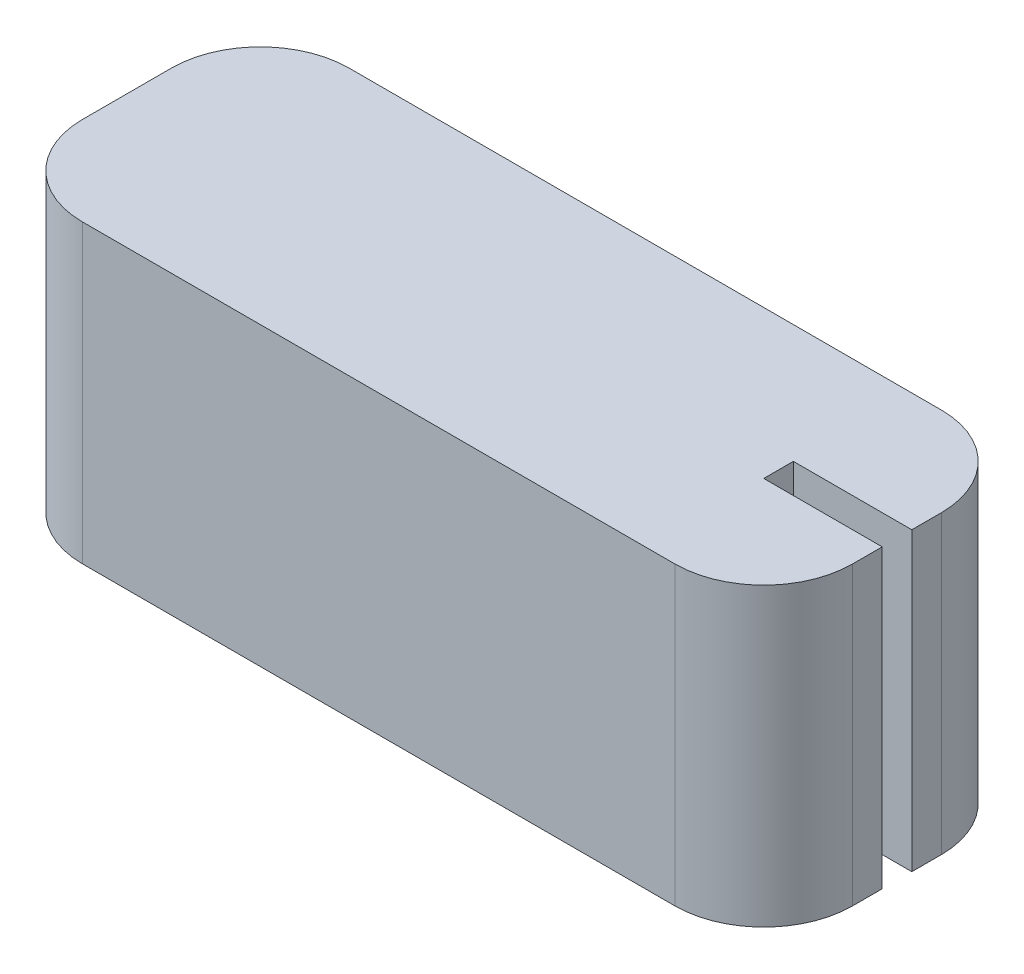
ISO-10303-21;
HEADER;
FILE_DESCRIPTION(('STEP AP214'),'2;1');
FILE_NAME('part.step','',(''),(''),'','','');
FILE_SCHEMA(('AUTOMOTIVE_DESIGN { 1 0 10303 214 1 1 1 1 }'));
ENDSEC;
DATA;
#1=APPLICATION_CONTEXT('core data for automotive mechanical design processes');
#2=APPLICATION_PROTOCOL_DEFINITION('international standard','automotive_design',2000,#1);
#3=PRODUCT_CONTEXT('',#1,'mechanical');
#4=PRODUCT('Part','Part','',(#3));
#5=PRODUCT_RELATED_PRODUCT_CATEGORY('part','',(#4));
#6=PRODUCT_DEFINITION_FORMATION('','',#4);
#7=PRODUCT_DEFINITION_CONTEXT('part definition',#1,'design');
#8=PRODUCT_DEFINITION('design','',#6,#7);
#9=PRODUCT_DEFINITION_SHAPE('','',#8);
#10=(LENGTH_UNIT() NAMED_UNIT(*) SI_UNIT(.MILLI.,.METRE.));
#11=(NAMED_UNIT(*) PLANE_ANGLE_UNIT() SI_UNIT($,.RADIAN.));
#12=(NAMED_UNIT(*) SI_UNIT($,.STERADIAN.) SOLID_ANGLE_UNIT());
#13=UNCERTAINTY_MEASURE_WITH_UNIT(LENGTH_MEASURE(1.E-05),#10,'distance_accuracy_value','');
#14=(GEOMETRIC_REPRESENTATION_CONTEXT(3) GLOBAL_UNCERTAINTY_ASSIGNED_CONTEXT((#13)) GLOBAL_UNIT_ASSIGNED_CONTEXT((#10,
#11,#12)) REPRESENTATION_CONTEXT('',''));
#15=CARTESIAN_POINT('',(0.,0.,0.));
#16=DIRECTION('',(0.,0.,1.));
#17=DIRECTION('',(1.,0.,0.));
#18=AXIS2_PLACEMENT_3D('',#15,#16,#17);
#19=CARTESIAN_POINT('',(21.,0.,-4.5));
#20=DIRECTION('',(1.,0.,0.));
#21=DIRECTION('',(0.,0.,-1.));
#22=AXIS2_PLACEMENT_3D('',#19,#20,#21);
#23=PLANE('',#22);
#24=DIRECTION('',(0.,0.,-1.));
#25=VECTOR('',#24,1.);
#26=CARTESIAN_POINT('',(21.,0.,-4.5));
#27=LINE('',#26,#25);
#28=CARTESIAN_POINT('',(21.,0.,-0.5));
#29=VERTEX_POINT('',#28);
#30=CARTESIAN_POINT('',(21.,0.,-1.5));
#31=VERTEX_POINT('',#30);
#32=EDGE_CURVE('E273',#29,#31,#27,.T.);
#33=ORIENTED_EDGE('',*,*,#32,.T.);
#34=DIRECTION('',(0.,1.,0.));
#35=VECTOR('',#34,1.);
#36=CARTESIAN_POINT('',(21.,0.,-1.5));
#37=LINE('',#36,#35);
#38=CARTESIAN_POINT('',(21.,10.,-1.5));
#39=VERTEX_POINT('',#38);
#40=EDGE_CURVE('E297',#31,#39,#37,.T.);
#41=ORIENTED_EDGE('',*,*,#40,.T.);
#42=DIRECTION('',(0.,0.,-1.));
#43=VECTOR('',#42,1.);
#44=CARTESIAN_POINT('',(21.,10.,-4.5));
#45=LINE('',#44,#43);
#46=CARTESIAN_POINT('',(21.,10.,-0.5));
#47=VERTEX_POINT('',#46);
#48=EDGE_CURVE('E226',#47,#39,#45,.T.);
#49=ORIENTED_EDGE('',*,*,#48,.F.);
#50=DIRECTION('',(0.,1.,0.));
#51=VECTOR('',#50,1.);
#52=CARTESIAN_POINT('',(21.,10.,-0.5));
#53=LINE('',#52,#51);
#54=EDGE_CURVE('E195',#47,#29,#53,.F.);
#55=ORIENTED_EDGE('',*,*,#54,.T.);
#56=EDGE_LOOP('',(#33,#41,#49,#55));
#57=FACE_BOUND('',#56,.T.);
#58=ADVANCED_FACE('F49',(#57),#23,.T.);
#59=CARTESIAN_POINT('',(15.6,0.,0.));
#60=DIRECTION('',(0.,1.,0.));
#61=DIRECTION('',(0.,0.,1.));
#62=AXIS2_PLACEMENT_3D('',#59,#60,#61);
#63=CYLINDRICAL_SURFACE('',#62,2.6);
#64=DIRECTION('',(0.,1.,0.));
#65=VECTOR('',#64,1.);
#66=CARTESIAN_POINT('',(18.1514701644346,0.,-0.5));
#67=LINE('',#66,#65);
#68=CARTESIAN_POINT('',(18.1514701644346,5.,-0.5));
#69=VERTEX_POINT('',#68);
#70=CARTESIAN_POINT('',(18.1514701644346,0.,-0.5));
#71=VERTEX_POINT('',#70);
#72=EDGE_CURVE('E214',#69,#71,#67,.F.);
#73=ORIENTED_EDGE('',*,*,#72,.F.);
#74=CARTESIAN_POINT('',(15.6,5.,0.));
#75=DIRECTION('',(0.,1.,0.));
#76=DIRECTION('',(0.,0.,1.));
#77=AXIS2_PLACEMENT_3D('',#74,#75,#76);
#78=CIRCLE('',#77,2.6);
#79=CARTESIAN_POINT('',(15.775,5.,-2.59410389152015));
#80=VERTEX_POINT('',#79);
#81=EDGE_CURVE('E251',#69,#80,#78,.T.);
#82=ORIENTED_EDGE('',*,*,#81,.T.);
#83=DIRECTION('',(0.,1.,0.));
#84=VECTOR('',#83,1.);
#85=CARTESIAN_POINT('',(15.775,0.,-2.59410389152015));
#86=LINE('',#85,#84);
#87=CARTESIAN_POINT('',(15.775,0.,-2.59410389152015));
#88=VERTEX_POINT('',#87);
#89=EDGE_CURVE('E261',#88,#80,#86,.T.);
#90=ORIENTED_EDGE('',*,*,#89,.F.);
#91=CARTESIAN_POINT('',(15.6,0.,0.));
#92=DIRECTION('',(0.,1.,0.));
#93=DIRECTION('',(0.,0.,1.));
#94=AXIS2_PLACEMENT_3D('',#91,#92,#93);
#95=CIRCLE('',#94,2.6);
#96=EDGE_CURVE('E238',#71,#88,#95,.T.);
#97=ORIENTED_EDGE('',*,*,#96,.F.);
#98=EDGE_LOOP('',(#73,#82,#90,#97));
#99=FACE_BOUND('',#98,.T.);
#100=ADVANCED_FACE('F369',(#99),#63,.F.);
#101=CARTESIAN_POINT('',(-5.,0.,-4.5));
#102=DIRECTION('',(-1.,0.,0.));
#103=DIRECTION('',(0.,0.,1.));
#104=AXIS2_PLACEMENT_3D('',#101,#102,#103);
#105=PLANE('',#104);
#106=DIRECTION('',(0.,0.,1.));
#107=VECTOR('',#106,1.);
#108=CARTESIAN_POINT('',(-5.,10.,-4.5));
#109=LINE('',#108,#107);
#110=CARTESIAN_POINT('',(-5.,10.,-1.5));
#111=VERTEX_POINT('',#110);
#112=CARTESIAN_POINT('',(-5.,10.,1.5));
#113=VERTEX_POINT('',#112);
#114=EDGE_CURVE('E220',#111,#113,#109,.T.);
#115=ORIENTED_EDGE('',*,*,#114,.F.);
#116=DIRECTION('',(0.,1.,0.));
#117=VECTOR('',#116,1.);
#118=CARTESIAN_POINT('',(-5.,0.,-1.5));
#119=LINE('',#118,#117);
#120=CARTESIAN_POINT('',(-5.,0.,-1.5));
#121=VERTEX_POINT('',#120);
#122=EDGE_CURVE('E288',#111,#121,#119,.F.);
#123=ORIENTED_EDGE('',*,*,#122,.T.);
#124=DIRECTION('',(0.,0.,1.));
#125=VECTOR('',#124,1.);
#126=CARTESIAN_POINT('',(-5.,0.,-4.5));
#127=LINE('',#126,#125);
#128=CARTESIAN_POINT('',(-5.,0.,1.5));
#129=VERTEX_POINT('',#128);
#130=EDGE_CURVE('E260',#121,#129,#127,.T.);
#131=ORIENTED_EDGE('',*,*,#130,.T.);
#132=DIRECTION('',(0.,1.,0.));
#133=VECTOR('',#132,1.);
#134=CARTESIAN_POINT('',(-5.,0.,1.5));
#135=LINE('',#134,#133);
#136=EDGE_CURVE('E285',#129,#113,#135,.T.);
#137=ORIENTED_EDGE('',*,*,#136,.T.);
#138=EDGE_LOOP('',(#115,#123,#131,#137));
#139=FACE_BOUND('',#138,.T.);
#140=ADVANCED_FACE('F321',(#139),#105,.T.);
#141=CARTESIAN_POINT('',(-5.,0.,-4.5));
#142=DIRECTION('',(0.,0.,-1.));
#143=DIRECTION('',(-1.,0.,0.));
#144=AXIS2_PLACEMENT_3D('',#141,#142,#143);
#145=PLANE('',#144);
#146=DIRECTION('',(-1.,0.,0.));
#147=VECTOR('',#146,1.);
#148=CARTESIAN_POINT('',(-5.,10.,-4.5));
#149=LINE('',#148,#147);
#150=CARTESIAN_POINT('',(18.,10.,-4.5));
#151=VERTEX_POINT('',#150);
#152=CARTESIAN_POINT('',(-2.,10.,-4.5));
#153=VERTEX_POINT('',#152);
#154=EDGE_CURVE('E228',#151,#153,#149,.T.);
#155=ORIENTED_EDGE('',*,*,#154,.F.);
#156=DIRECTION('',(0.,1.,0.));
#157=VECTOR('',#156,1.);
#158=CARTESIAN_POINT('',(18.,0.,-4.5));
#159=LINE('',#158,#157);
#160=CARTESIAN_POINT('',(18.,0.,-4.5));
#161=VERTEX_POINT('',#160);
#162=EDGE_CURVE('E304',#151,#161,#159,.F.);
#163=ORIENTED_EDGE('',*,*,#162,.T.);
#164=DIRECTION('',(-1.,0.,0.));
#165=VECTOR('',#164,1.);
#166=CARTESIAN_POINT('',(-5.,0.,-4.5));
#167=LINE('',#166,#165);
#168=CARTESIAN_POINT('',(-2.,0.,-4.5));
#169=VERTEX_POINT('',#168);
#170=EDGE_CURVE('E276',#161,#169,#167,.T.);
#171=ORIENTED_EDGE('',*,*,#170,.T.);
#172=DIRECTION('',(0.,1.,0.));
#173=VECTOR('',#172,1.);
#174=CARTESIAN_POINT('',(-2.,0.,-4.5));
#175=LINE('',#174,#173);
#176=EDGE_CURVE('E278',#169,#153,#175,.T.);
#177=ORIENTED_EDGE('',*,*,#176,.T.);
#178=EDGE_LOOP('',(#155,#163,#171,#177));
#179=FACE_BOUND('',#178,.T.);
#180=ADVANCED_FACE('F333',(#179),#145,.T.);
#181=CARTESIAN_POINT('',(21.,10.,1.5));
#182=VERTEX_POINT('',#181);
#183=CARTESIAN_POINT('',(21.,10.,0.5));
#184=VERTEX_POINT('',#183);
#185=EDGE_CURVE('E199',#182,#184,#45,.T.);
#186=ORIENTED_EDGE('',*,*,#185,.F.);
#187=DIRECTION('',(0.,1.,0.));
#188=VECTOR('',#187,1.);
#189=CARTESIAN_POINT('',(21.,0.,1.5));
#190=LINE('',#189,#188);
#191=CARTESIAN_POINT('',(21.,0.,1.5));
#192=VERTEX_POINT('',#191);
#193=EDGE_CURVE('E12',#182,#192,#190,.F.);
#194=ORIENTED_EDGE('',*,*,#193,.T.);
#195=CARTESIAN_POINT('',(21.,0.,0.5));
#196=VERTEX_POINT('',#195);
#197=EDGE_CURVE('E274',#192,#196,#27,.T.);
#198=ORIENTED_EDGE('',*,*,#197,.T.);
#199=DIRECTION('',(0.,1.,0.));
#200=VECTOR('',#199,1.);
#201=CARTESIAN_POINT('',(21.,10.,0.5));
#202=LINE('',#201,#200);
#203=EDGE_CURVE('E348',#184,#196,#202,.F.);
#204=ORIENTED_EDGE('',*,*,#203,.F.);
#205=EDGE_LOOP('',(#186,#194,#198,#204));
#206=FACE_BOUND('',#205,.T.);
#207=ADVANCED_FACE('F379',(#206),#23,.T.);
#208=CARTESIAN_POINT('',(-5.,0.,4.5));
#209=DIRECTION('',(0.,0.,1.));
#210=DIRECTION('',(1.,0.,0.));
#211=AXIS2_PLACEMENT_3D('',#208,#209,#210);
#212=PLANE('',#211);
#213=DIRECTION('',(1.,0.,0.));
#214=VECTOR('',#213,1.);
#215=CARTESIAN_POINT('',(-5.,0.,4.5));
#216=LINE('',#215,#214);
#217=CARTESIAN_POINT('',(-2.,0.,4.5));
#218=VERTEX_POINT('',#217);
#219=CARTESIAN_POINT('',(18.,0.,4.5));
#220=VERTEX_POINT('',#219);
#221=EDGE_CURVE('E271',#218,#220,#216,.T.);
#222=ORIENTED_EDGE('',*,*,#221,.T.);
#223=DIRECTION('',(0.,1.,0.));
#224=VECTOR('',#223,1.);
#225=CARTESIAN_POINT('',(18.,0.,4.5));
#226=LINE('',#225,#224);
#227=CARTESIAN_POINT('',(18.,10.,4.5));
#228=VERTEX_POINT('',#227);
#229=EDGE_CURVE('E57',#220,#228,#226,.T.);
#230=ORIENTED_EDGE('',*,*,#229,.T.);
#231=DIRECTION('',(1.,0.,0.));
#232=VECTOR('',#231,1.);
#233=CARTESIAN_POINT('',(-5.,10.,4.5));
#234=LINE('',#233,#232);
#235=CARTESIAN_POINT('',(-2.,10.,4.5));
#236=VERTEX_POINT('',#235);
#237=EDGE_CURVE('E223',#236,#228,#234,.T.);
#238=ORIENTED_EDGE('',*,*,#237,.F.);
#239=DIRECTION('',(0.,1.,0.));
#240=VECTOR('',#239,1.);
#241=CARTESIAN_POINT('',(-2.,0.,4.5));
#242=LINE('',#241,#240);
#243=EDGE_CURVE('E295',#236,#218,#242,.F.);
#244=ORIENTED_EDGE('',*,*,#243,.T.);
#245=EDGE_LOOP('',(#222,#230,#238,#244));
#246=FACE_BOUND('',#245,.T.);
#247=ADVANCED_FACE('F312',(#246),#212,.T.);
#248=CARTESIAN_POINT('',(0.,0.,0.));
#249=DIRECTION('',(0.,1.,0.));
#250=DIRECTION('',(0.,0.,1.));
#251=AXIS2_PLACEMENT_3D('',#248,#249,#250);
#252=PLANE('',#251);
#253=ORIENTED_EDGE('',*,*,#170,.F.);
#254=CARTESIAN_POINT('',(18.,0.,-1.5));
#255=DIRECTION('',(0.,1.,0.));
#256=DIRECTION('',(0.,0.,1.));
#257=AXIS2_PLACEMENT_3D('',#254,#255,#256);
#258=CIRCLE('',#257,3.);
#259=EDGE_CURVE('E307',#161,#31,#258,.F.);
#260=ORIENTED_EDGE('',*,*,#259,.T.);
#261=ORIENTED_EDGE('',*,*,#32,.F.);
#262=DIRECTION('',(1.,0.,0.));
#263=VECTOR('',#262,1.);
#264=CARTESIAN_POINT('',(17.,0.,-0.5));
#265=LINE('',#264,#263);
#266=EDGE_CURVE('E205',#71,#29,#265,.T.);
#267=ORIENTED_EDGE('',*,*,#266,.F.);
#268=ORIENTED_EDGE('',*,*,#96,.T.);
#269=DIRECTION('',(-0.997732265969289,0.,-0.0673076923076924));
#270=VECTOR('',#269,1.);
#271=CARTESIAN_POINT('',(15.775,0.,-2.59410389152015));
#272=LINE('',#271,#270);
#273=CARTESIAN_POINT('',(0.245673076923077,0.,-3.64172277078791));
#274=VERTEX_POINT('',#273);
#275=EDGE_CURVE('E242',#88,#274,#272,.T.);
#276=ORIENTED_EDGE('',*,*,#275,.T.);
#277=CARTESIAN_POINT('',(0.,0.,0.));
#278=DIRECTION('',(0.,1.,0.));
#279=DIRECTION('',(0.,0.,1.));
#280=AXIS2_PLACEMENT_3D('',#277,#278,#279);
#281=CIRCLE('',#280,3.65);
#282=CARTESIAN_POINT('',(0.245673076923076,0.,3.64172277078791));
#283=VERTEX_POINT('',#282);
#284=EDGE_CURVE('E231',#274,#283,#281,.T.);
#285=ORIENTED_EDGE('',*,*,#284,.T.);
#286=DIRECTION('',(0.99773226596929,0.,-0.0673076923076923));
#287=VECTOR('',#286,1.);
#288=CARTESIAN_POINT('',(0.245673076923076,0.,3.64172277078791));
#289=LINE('',#288,#287);
#290=CARTESIAN_POINT('',(15.775,0.,2.59410389152015));
#291=VERTEX_POINT('',#290);
#292=EDGE_CURVE('E234',#283,#291,#289,.T.);
#293=ORIENTED_EDGE('',*,*,#292,.T.);
#294=CARTESIAN_POINT('',(18.1514701644346,0.,0.5));
#295=VERTEX_POINT('',#294);
#296=EDGE_CURVE('E239',#291,#295,#95,.T.);
#297=ORIENTED_EDGE('',*,*,#296,.T.);
#298=DIRECTION('',(1.,0.,0.));
#299=VECTOR('',#298,1.);
#300=CARTESIAN_POINT('',(17.,0.,0.5));
#301=LINE('',#300,#299);
#302=EDGE_CURVE('E185',#295,#196,#301,.T.);
#303=ORIENTED_EDGE('',*,*,#302,.T.);
#304=ORIENTED_EDGE('',*,*,#197,.F.);
#305=CARTESIAN_POINT('',(18.,0.,1.5));
#306=DIRECTION('',(0.,1.,0.));
#307=DIRECTION('',(0.,0.,1.));
#308=AXIS2_PLACEMENT_3D('',#305,#306,#307);
#309=CIRCLE('',#308,3.);
#310=EDGE_CURVE('E64',#192,#220,#309,.F.);
#311=ORIENTED_EDGE('',*,*,#310,.T.);
#312=ORIENTED_EDGE('',*,*,#221,.F.);
#313=CARTESIAN_POINT('',(-2.,0.,1.5));
#314=DIRECTION('',(0.,1.,0.));
#315=DIRECTION('',(0.,0.,1.));
#316=AXIS2_PLACEMENT_3D('',#313,#314,#315);
#317=CIRCLE('',#316,3.);
#318=EDGE_CURVE('E290',#218,#129,#317,.F.);
#319=ORIENTED_EDGE('',*,*,#318,.T.);
#320=ORIENTED_EDGE('',*,*,#130,.F.);
#321=CARTESIAN_POINT('',(-2.,0.,-1.5));
#322=DIRECTION('',(0.,1.,0.));
#323=DIRECTION('',(0.,0.,1.));
#324=AXIS2_PLACEMENT_3D('',#321,#322,#323);
#325=CIRCLE('',#324,3.);
#326=EDGE_CURVE('E292',#121,#169,#325,.F.);
#327=ORIENTED_EDGE('',*,*,#326,.T.);
#328=EDGE_LOOP('',(#253,#260,#261,#267,#268,#276,#285,#293,#297,#303,#304,#311,#312,#319,#320,#327));
#329=FACE_BOUND('',#328,.T.);
#330=ADVANCED_FACE('F326',(#329),#252,.F.);
#331=CARTESIAN_POINT('',(0.,0.,0.));
#332=DIRECTION('',(0.,1.,0.));
#333=DIRECTION('',(0.,0.,1.));
#334=AXIS2_PLACEMENT_3D('',#331,#332,#333);
#335=CYLINDRICAL_SURFACE('',#334,3.65);
#336=CARTESIAN_POINT('',(0.,5.,0.));
#337=DIRECTION('',(0.,1.,0.));
#338=DIRECTION('',(0.,0.,1.));
#339=AXIS2_PLACEMENT_3D('',#336,#337,#338);
#340=CIRCLE('',#339,3.65);
#341=CARTESIAN_POINT('',(0.245673076923077,5.,-3.64172277078791));
#342=VERTEX_POINT('',#341);
#343=CARTESIAN_POINT('',(0.245673076923076,5.,3.64172277078791));
#344=VERTEX_POINT('',#343);
#345=EDGE_CURVE('E230',#342,#344,#340,.T.);
#346=ORIENTED_EDGE('',*,*,#345,.T.);
#347=DIRECTION('',(0.,1.,0.));
#348=VECTOR('',#347,1.);
#349=CARTESIAN_POINT('',(0.245673076923076,0.,3.64172277078791));
#350=LINE('',#349,#348);
#351=EDGE_CURVE('E245',#283,#344,#350,.T.);
#352=ORIENTED_EDGE('',*,*,#351,.F.);
#353=ORIENTED_EDGE('',*,*,#284,.F.);
#354=DIRECTION('',(0.,1.,0.));
#355=VECTOR('',#354,1.);
#356=CARTESIAN_POINT('',(0.245673076923077,0.,-3.64172277078791));
#357=LINE('',#356,#355);
#358=EDGE_CURVE('E257',#274,#342,#357,.T.);
#359=ORIENTED_EDGE('',*,*,#358,.T.);
#360=EDGE_LOOP('',(#346,#352,#353,#359));
#361=FACE_BOUND('',#360,.T.);
#362=ADVANCED_FACE('F360',(#361),#335,.F.);
#363=CARTESIAN_POINT('',(15.775,0.,-2.59410389152015));
#364=DIRECTION('',(0.0673076923076924,0.,-0.997732265969289));
#365=DIRECTION('',(-0.99773226596929,0.,-0.0673076923076924));
#366=AXIS2_PLACEMENT_3D('',#363,#364,#365);
#367=PLANE('',#366);
#368=DIRECTION('',(-0.997732265969289,0.,-0.0673076923076924));
#369=VECTOR('',#368,1.);
#370=CARTESIAN_POINT('',(15.775,5.,-2.59410389152015));
#371=LINE('',#370,#369);
#372=EDGE_CURVE('E235',#80,#342,#371,.T.);
#373=ORIENTED_EDGE('',*,*,#372,.T.);
#374=ORIENTED_EDGE('',*,*,#358,.F.);
#375=ORIENTED_EDGE('',*,*,#275,.F.);
#376=ORIENTED_EDGE('',*,*,#89,.T.);
#377=EDGE_LOOP('',(#373,#374,#375,#376));
#378=FACE_BOUND('',#377,.T.);
#379=ADVANCED_FACE('F364',(#378),#367,.F.);
#380=CARTESIAN_POINT('',(15.775,5.,2.59410389152015));
#381=VERTEX_POINT('',#380);
#382=CARTESIAN_POINT('',(18.1514701644346,5.,0.5));
#383=VERTEX_POINT('',#382);
#384=EDGE_CURVE('E252',#381,#383,#78,.T.);
#385=ORIENTED_EDGE('',*,*,#384,.T.);
#386=DIRECTION('',(0.,1.,0.));
#387=VECTOR('',#386,1.);
#388=CARTESIAN_POINT('',(18.1514701644346,0.,0.5));
#389=LINE('',#388,#387);
#390=EDGE_CURVE('E217',#383,#295,#389,.F.);
#391=ORIENTED_EDGE('',*,*,#390,.T.);
#392=ORIENTED_EDGE('',*,*,#296,.F.);
#393=DIRECTION('',(0.,1.,0.));
#394=VECTOR('',#393,1.);
#395=CARTESIAN_POINT('',(15.775,0.,2.59410389152015));
#396=LINE('',#395,#394);
#397=EDGE_CURVE('E264',#291,#381,#396,.T.);
#398=ORIENTED_EDGE('',*,*,#397,.T.);
#399=EDGE_LOOP('',(#385,#391,#392,#398));
#400=FACE_BOUND('',#399,.T.);
#401=ADVANCED_FACE('F353',(#400),#63,.F.);
#402=CARTESIAN_POINT('',(0.245673076923076,0.,3.64172277078791));
#403=DIRECTION('',(0.0673076923076923,0.,0.99773226596929));
#404=DIRECTION('',(0.997732265969289,0.,-0.0673076923076923));
#405=AXIS2_PLACEMENT_3D('',#402,#403,#404);
#406=PLANE('',#405);
#407=DIRECTION('',(0.99773226596929,0.,-0.0673076923076923));
#408=VECTOR('',#407,1.);
#409=CARTESIAN_POINT('',(0.245673076923076,5.,3.64172277078791));
#410=LINE('',#409,#408);
#411=EDGE_CURVE('E248',#344,#381,#410,.T.);
#412=ORIENTED_EDGE('',*,*,#411,.T.);
#413=ORIENTED_EDGE('',*,*,#397,.F.);
#414=ORIENTED_EDGE('',*,*,#292,.F.);
#415=ORIENTED_EDGE('',*,*,#351,.T.);
#416=EDGE_LOOP('',(#412,#413,#414,#415));
#417=FACE_BOUND('',#416,.T.);
#418=ADVANCED_FACE('F355',(#417),#406,.F.);
#419=CARTESIAN_POINT('',(0.,5.,0.));
#420=DIRECTION('',(0.,1.,0.));
#421=DIRECTION('',(0.,0.,1.));
#422=AXIS2_PLACEMENT_3D('',#419,#420,#421);
#423=PLANE('',#422);
#424=DIRECTION('',(0.,0.,-1.));
#425=VECTOR('',#424,1.);
#426=CARTESIAN_POINT('',(17.,5.,0.));
#427=LINE('',#426,#425);
#428=CARTESIAN_POINT('',(17.,5.,0.5));
#429=VERTEX_POINT('',#428);
#430=CARTESIAN_POINT('',(17.,5.,-0.5));
#431=VERTEX_POINT('',#430);
#432=EDGE_CURVE('E200',#429,#431,#427,.T.);
#433=ORIENTED_EDGE('',*,*,#432,.F.);
#434=DIRECTION('',(1.,0.,0.));
#435=VECTOR('',#434,1.);
#436=CARTESIAN_POINT('',(0.,5.,0.5));
#437=LINE('',#436,#435);
#438=EDGE_CURVE('E194',#429,#383,#437,.T.);
#439=ORIENTED_EDGE('',*,*,#438,.T.);
#440=ORIENTED_EDGE('',*,*,#384,.F.);
#441=ORIENTED_EDGE('',*,*,#411,.F.);
#442=ORIENTED_EDGE('',*,*,#345,.F.);
#443=ORIENTED_EDGE('',*,*,#372,.F.);
#444=ORIENTED_EDGE('',*,*,#81,.F.);
#445=DIRECTION('',(1.,0.,0.));
#446=VECTOR('',#445,1.);
#447=CARTESIAN_POINT('',(0.,5.,-0.5));
#448=LINE('',#447,#446);
#449=EDGE_CURVE('E203',#431,#69,#448,.T.);
#450=ORIENTED_EDGE('',*,*,#449,.F.);
#451=EDGE_LOOP('',(#433,#439,#440,#441,#442,#443,#444,#450));
#452=FACE_BOUND('',#451,.T.);
#453=ADVANCED_FACE('F357',(#452),#423,.F.);
#454=CARTESIAN_POINT('',(0.,10.,0.));
#455=DIRECTION('',(0.,1.,0.));
#456=DIRECTION('',(0.,0.,1.));
#457=AXIS2_PLACEMENT_3D('',#454,#455,#456);
#458=PLANE('',#457);
#459=ORIENTED_EDGE('',*,*,#48,.T.);
#460=CARTESIAN_POINT('',(18.,10.,-1.5));
#461=DIRECTION('',(0.,1.,0.));
#462=DIRECTION('',(0.,0.,1.));
#463=AXIS2_PLACEMENT_3D('',#460,#461,#462);
#464=CIRCLE('',#463,3.);
#465=EDGE_CURVE('E302',#39,#151,#464,.T.);
#466=ORIENTED_EDGE('',*,*,#465,.T.);
#467=ORIENTED_EDGE('',*,*,#154,.T.);
#468=CARTESIAN_POINT('',(-2.,10.,-1.5));
#469=DIRECTION('',(0.,1.,0.));
#470=DIRECTION('',(0.,0.,1.));
#471=AXIS2_PLACEMENT_3D('',#468,#469,#470);
#472=CIRCLE('',#471,3.);
#473=EDGE_CURVE('E283',#153,#111,#472,.T.);
#474=ORIENTED_EDGE('',*,*,#473,.T.);
#475=ORIENTED_EDGE('',*,*,#114,.T.);
#476=CARTESIAN_POINT('',(-2.,10.,1.5));
#477=DIRECTION('',(0.,1.,0.));
#478=DIRECTION('',(0.,0.,1.));
#479=AXIS2_PLACEMENT_3D('',#476,#477,#478);
#480=CIRCLE('',#479,3.);
#481=EDGE_CURVE('E281',#113,#236,#480,.T.);
#482=ORIENTED_EDGE('',*,*,#481,.T.);
#483=ORIENTED_EDGE('',*,*,#237,.T.);
#484=CARTESIAN_POINT('',(18.,10.,1.5));
#485=DIRECTION('',(0.,1.,0.));
#486=DIRECTION('',(0.,0.,1.));
#487=AXIS2_PLACEMENT_3D('',#484,#485,#486);
#488=CIRCLE('',#487,3.);
#489=EDGE_CURVE('E300',#228,#182,#488,.T.);
#490=ORIENTED_EDGE('',*,*,#489,.T.);
#491=ORIENTED_EDGE('',*,*,#185,.T.);
#492=DIRECTION('',(1.,0.,0.));
#493=VECTOR('',#492,1.);
#494=CARTESIAN_POINT('',(17.,10.,0.5));
#495=LINE('',#494,#493);
#496=CARTESIAN_POINT('',(17.,10.,0.5));
#497=VERTEX_POINT('',#496);
#498=EDGE_CURVE('E191',#497,#184,#495,.T.);
#499=ORIENTED_EDGE('',*,*,#498,.F.);
#500=DIRECTION('',(0.,0.,-1.));
#501=VECTOR('',#500,1.);
#502=CARTESIAN_POINT('',(17.,10.,0.5));
#503=LINE('',#502,#501);
#504=CARTESIAN_POINT('',(17.,10.,-0.5));
#505=VERTEX_POINT('',#504);
#506=EDGE_CURVE('E174',#497,#505,#503,.T.);
#507=ORIENTED_EDGE('',*,*,#506,.T.);
#508=DIRECTION('',(1.,0.,0.));
#509=VECTOR('',#508,1.);
#510=CARTESIAN_POINT('',(17.,10.,-0.5));
#511=LINE('',#510,#509);
#512=EDGE_CURVE('E201',#505,#47,#511,.T.);
#513=ORIENTED_EDGE('',*,*,#512,.T.);
#514=EDGE_LOOP('',(#459,#466,#467,#474,#475,#482,#483,#490,#491,#499,#507,#513));
#515=FACE_BOUND('',#514,.T.);
#516=ADVANCED_FACE('F198',(#515),#458,.T.);
#517=CARTESIAN_POINT('',(17.,10.,0.5));
#518=DIRECTION('',(0.,0.,1.));
#519=DIRECTION('',(1.,0.,0.));
#520=AXIS2_PLACEMENT_3D('',#517,#518,#519);
#521=PLANE('',#520);
#522=ORIENTED_EDGE('',*,*,#438,.F.);
#523=DIRECTION('',(0.,1.,0.));
#524=VECTOR('',#523,1.);
#525=CARTESIAN_POINT('',(17.,10.,0.5));
#526=LINE('',#525,#524);
#527=EDGE_CURVE('E177',#497,#429,#526,.F.);
#528=ORIENTED_EDGE('',*,*,#527,.F.);
#529=ORIENTED_EDGE('',*,*,#498,.T.);
#530=ORIENTED_EDGE('',*,*,#203,.T.);
#531=ORIENTED_EDGE('',*,*,#302,.F.);
#532=ORIENTED_EDGE('',*,*,#390,.F.);
#533=EDGE_LOOP('',(#522,#528,#529,#530,#531,#532));
#534=FACE_BOUND('',#533,.T.);
#535=ADVANCED_FACE('F189',(#534),#521,.F.);
#536=CARTESIAN_POINT('',(17.,10.,-0.5));
#537=DIRECTION('',(0.,0.,1.));
#538=DIRECTION('',(1.,0.,0.));
#539=AXIS2_PLACEMENT_3D('',#536,#537,#538);
#540=PLANE('',#539);
#541=ORIENTED_EDGE('',*,*,#72,.T.);
#542=ORIENTED_EDGE('',*,*,#266,.T.);
#543=ORIENTED_EDGE('',*,*,#54,.F.);
#544=ORIENTED_EDGE('',*,*,#512,.F.);
#545=DIRECTION('',(0.,1.,0.));
#546=VECTOR('',#545,1.);
#547=CARTESIAN_POINT('',(17.,10.,-0.5));
#548=LINE('',#547,#546);
#549=EDGE_CURVE('E180',#505,#431,#548,.F.);
#550=ORIENTED_EDGE('',*,*,#549,.T.);
#551=ORIENTED_EDGE('',*,*,#449,.T.);
#552=EDGE_LOOP('',(#541,#542,#543,#544,#550,#551));
#553=FACE_BOUND('',#552,.T.);
#554=ADVANCED_FACE('F345',(#553),#540,.T.);
#555=CARTESIAN_POINT('',(17.,0.,0.));
#556=DIRECTION('',(1.,0.,0.));
#557=DIRECTION('',(0.,0.,-1.));
#558=AXIS2_PLACEMENT_3D('',#555,#556,#557);
#559=PLANE('',#558);
#560=ORIENTED_EDGE('',*,*,#432,.T.);
#561=ORIENTED_EDGE('',*,*,#549,.F.);
#562=ORIENTED_EDGE('',*,*,#506,.F.);
#563=ORIENTED_EDGE('',*,*,#527,.T.);
#564=EDGE_LOOP('',(#560,#561,#562,#563));
#565=FACE_BOUND('',#564,.T.);
#566=ADVANCED_FACE('F176',(#565),#559,.T.);
#567=CARTESIAN_POINT('',(-2.,0.,-1.5));
#568=DIRECTION('',(0.,1.,0.));
#569=DIRECTION('',(0.,0.,1.));
#570=AXIS2_PLACEMENT_3D('',#567,#568,#569);
#571=CYLINDRICAL_SURFACE('',#570,3.);
#572=ORIENTED_EDGE('',*,*,#326,.F.);
#573=ORIENTED_EDGE('',*,*,#122,.F.);
#574=ORIENTED_EDGE('',*,*,#473,.F.);
#575=ORIENTED_EDGE('',*,*,#176,.F.);
#576=EDGE_LOOP('',(#572,#573,#574,#575));
#577=FACE_BOUND('',#576,.T.);
#578=ADVANCED_FACE('F329',(#577),#571,.T.);
#579=CARTESIAN_POINT('',(-2.,0.,1.5));
#580=DIRECTION('',(0.,1.,0.));
#581=DIRECTION('',(0.,0.,1.));
#582=AXIS2_PLACEMENT_3D('',#579,#580,#581);
#583=CYLINDRICAL_SURFACE('',#582,3.);
#584=ORIENTED_EDGE('',*,*,#318,.F.);
#585=ORIENTED_EDGE('',*,*,#243,.F.);
#586=ORIENTED_EDGE('',*,*,#481,.F.);
#587=ORIENTED_EDGE('',*,*,#136,.F.);
#588=EDGE_LOOP('',(#584,#585,#586,#587));
#589=FACE_BOUND('',#588,.T.);
#590=ADVANCED_FACE('F319',(#589),#583,.T.);
#591=CARTESIAN_POINT('',(18.,0.,-1.5));
#592=DIRECTION('',(0.,1.,0.));
#593=DIRECTION('',(0.,0.,1.));
#594=AXIS2_PLACEMENT_3D('',#591,#592,#593);
#595=CYLINDRICAL_SURFACE('',#594,3.);
#596=ORIENTED_EDGE('',*,*,#259,.F.);
#597=ORIENTED_EDGE('',*,*,#162,.F.);
#598=ORIENTED_EDGE('',*,*,#465,.F.);
#599=ORIENTED_EDGE('',*,*,#40,.F.);
#600=EDGE_LOOP('',(#596,#597,#598,#599));
#601=FACE_BOUND('',#600,.T.);
#602=ADVANCED_FACE('F340',(#601),#595,.T.);
#603=CARTESIAN_POINT('',(18.,0.,1.5));
#604=DIRECTION('',(0.,1.,0.));
#605=DIRECTION('',(0.,0.,1.));
#606=AXIS2_PLACEMENT_3D('',#603,#604,#605);
#607=CYLINDRICAL_SURFACE('',#606,3.);
#608=ORIENTED_EDGE('',*,*,#310,.F.);
#609=ORIENTED_EDGE('',*,*,#193,.F.);
#610=ORIENTED_EDGE('',*,*,#489,.F.);
#611=ORIENTED_EDGE('',*,*,#229,.F.);
#612=EDGE_LOOP('',(#608,#609,#610,#611));
#613=FACE_BOUND('',#612,.T.);
#614=ADVANCED_FACE('F51',(#613),#607,.T.);
#615=CLOSED_SHELL('',(#58,#100,#140,#180,#207,#247,#330,#362,#379,#401,#418,#453,#516,#535,#554,
#566,#578,#590,#602,#614));
#616=MANIFOLD_SOLID_BREP('B2',#615);
#617=CARTESIAN_POINT('',(0.,5.,0.));
#618=DIRECTION('',(0.,-1.,0.));
#619=DIRECTION('',(0.,0.,-1.));
#620=AXIS2_PLACEMENT_3D('',#617,#618,#619);
#621=CYLINDRICAL_SURFACE('',#620,3.65);
#622=CARTESIAN_POINT('',(0.,5.,0.));
#623=DIRECTION('',(0.,1.,0.));
#624=DIRECTION('',(0.,0.,1.));
#625=AXIS2_PLACEMENT_3D('',#622,#623,#624);
#626=CIRCLE('',#625,3.65);
#627=CARTESIAN_POINT('',(0.245673076923077,5.,-3.64172277078791));
#628=VERTEX_POINT('',#627);
#629=CARTESIAN_POINT('',(0.245673076923077,5.,3.64172277078791));
#630=VERTEX_POINT('',#629);
#631=EDGE_CURVE('E47',#628,#630,#626,.T.);
#632=ORIENTED_EDGE('',*,*,#631,.F.);
#633=DIRECTION('',(0.,1.,0.));
#634=VECTOR('',#633,1.);
#635=CARTESIAN_POINT('',(0.245673076923077,4.,-3.64172277078791));
#636=LINE('',#635,#634);
#637=CARTESIAN_POINT('',(0.245673076923077,4.,-3.64172277078791));
#638=VERTEX_POINT('',#637);
#639=EDGE_CURVE('E654',#638,#628,#636,.T.);
#640=ORIENTED_EDGE('',*,*,#639,.F.);
#641=CARTESIAN_POINT('',(0.,4.,0.));
#642=DIRECTION('',(0.,-1.,0.));
#643=DIRECTION('',(0.,0.,1.));
#644=AXIS2_PLACEMENT_3D('',#641,#642,#643);
#645=CIRCLE('',#644,3.65);
#646=CARTESIAN_POINT('',(0.245673076923077,4.,3.64172277078791));
#647=VERTEX_POINT('',#646);
#648=EDGE_CURVE('E608',#638,#647,#645,.T.);
#649=ORIENTED_EDGE('',*,*,#648,.T.);
#650=DIRECTION('',(0.,1.,0.));
#651=VECTOR('',#650,1.);
#652=CARTESIAN_POINT('',(0.245673076923077,4.,3.64172277078791));
#653=LINE('',#652,#651);
#654=EDGE_CURVE('E632',#647,#630,#653,.T.);
#655=ORIENTED_EDGE('',*,*,#654,.T.);
#656=EDGE_LOOP('',(#632,#640,#649,#655));
#657=FACE_BOUND('',#656,.T.);
#658=CARTESIAN_POINT('',(0.,0.,0.));
#659=DIRECTION('',(0.,1.,0.));
#660=DIRECTION('',(0.,0.,1.));
#661=AXIS2_PLACEMENT_3D('',#658,#659,#660);
#662=CIRCLE('',#661,3.65);
#663=CARTESIAN_POINT('',(0.,0.,3.65));
#664=VERTEX_POINT('',#663);
#665=EDGE_CURVE('E589',#664,#664,#662,.T.);
#666=ORIENTED_EDGE('',*,*,#665,.T.);
#667=EDGE_LOOP('',(#666));
#668=FACE_BOUND('',#667,.T.);
#669=ADVANCED_FACE('F586',(#657,#668),#621,.T.);
#670=CARTESIAN_POINT('',(0.,5.,0.));
#671=DIRECTION('',(0.,1.,0.));
#672=DIRECTION('',(0.,0.,1.));
#673=AXIS2_PLACEMENT_3D('',#670,#671,#672);
#674=PLANE('',#673);
#675=ORIENTED_EDGE('',*,*,#631,.T.);
#676=DIRECTION('',(0.997732265969289,0.,-0.0673076923076923));
#677=VECTOR('',#676,1.);
#678=CARTESIAN_POINT('',(0.245673076923077,5.,3.64172277078791));
#679=LINE('',#678,#677);
#680=CARTESIAN_POINT('',(15.775,5.,2.59410389152015));
#681=VERTEX_POINT('',#680);
#682=EDGE_CURVE('E650',#630,#681,#679,.T.);
#683=ORIENTED_EDGE('',*,*,#682,.T.);
#684=CARTESIAN_POINT('',(15.6,5.,0.));
#685=DIRECTION('',(0.,1.,0.));
#686=DIRECTION('',(0.,0.,1.));
#687=AXIS2_PLACEMENT_3D('',#684,#685,#686);
#688=CIRCLE('',#687,2.6);
#689=CARTESIAN_POINT('',(15.775,5.,-2.59410389152015));
#690=VERTEX_POINT('',#689);
#691=EDGE_CURVE('E638',#681,#690,#688,.T.);
#692=ORIENTED_EDGE('',*,*,#691,.T.);
#693=DIRECTION('',(-0.997732265969289,0.,-0.0673076923076923));
#694=VECTOR('',#693,1.);
#695=CARTESIAN_POINT('',(15.775,5.,-2.59410389152015));
#696=LINE('',#695,#694);
#697=EDGE_CURVE('E599',#690,#628,#696,.T.);
#698=ORIENTED_EDGE('',*,*,#697,.T.);
#699=EDGE_LOOP('',(#675,#683,#692,#698));
#700=FACE_BOUND('',#699,.T.);
#701=ADVANCED_FACE('F661',(#700),#674,.T.);
#702=CARTESIAN_POINT('',(0.,0.,0.));
#703=DIRECTION('',(0.,1.,0.));
#704=DIRECTION('',(0.,0.,1.));
#705=AXIS2_PLACEMENT_3D('',#702,#703,#704);
#706=PLANE('',#705);
#707=ORIENTED_EDGE('',*,*,#665,.F.);
#708=EDGE_LOOP('',(#707));
#709=FACE_BOUND('',#708,.T.);
#710=ADVANCED_FACE('F665',(#709),#706,.F.);
#711=CARTESIAN_POINT('',(15.775,4.,-2.59410389152015));
#712=DIRECTION('',(0.0673076923076923,0.,-0.997732265969289));
#713=DIRECTION('',(-0.99773226596929,0.,-0.0673076923076923));
#714=AXIS2_PLACEMENT_3D('',#711,#712,#713);
#715=PLANE('',#714);
#716=ORIENTED_EDGE('',*,*,#697,.F.);
#717=DIRECTION('',(0.,1.,0.));
#718=VECTOR('',#717,1.);
#719=CARTESIAN_POINT('',(15.775,4.,-2.59410389152015));
#720=LINE('',#719,#718);
#721=CARTESIAN_POINT('',(15.775,4.,-2.59410389152015));
#722=VERTEX_POINT('',#721);
#723=EDGE_CURVE('E626',#722,#690,#720,.T.);
#724=ORIENTED_EDGE('',*,*,#723,.F.);
#725=DIRECTION('',(-0.997732265969289,0.,-0.0673076923076923));
#726=VECTOR('',#725,1.);
#727=CARTESIAN_POINT('',(15.775,4.,-2.59410389152015));
#728=LINE('',#727,#726);
#729=EDGE_CURVE('E643',#722,#638,#728,.T.);
#730=ORIENTED_EDGE('',*,*,#729,.T.);
#731=ORIENTED_EDGE('',*,*,#639,.T.);
#732=EDGE_LOOP('',(#716,#724,#730,#731));
#733=FACE_BOUND('',#732,.T.);
#734=ADVANCED_FACE('F663',(#733),#715,.T.);
#735=CARTESIAN_POINT('',(15.6,4.,0.));
#736=DIRECTION('',(0.,1.,0.));
#737=DIRECTION('',(0.,0.,1.));
#738=AXIS2_PLACEMENT_3D('',#735,#736,#737);
#739=CYLINDRICAL_SURFACE('',#738,2.6);
#740=ORIENTED_EDGE('',*,*,#691,.F.);
#741=DIRECTION('',(0.,1.,0.));
#742=VECTOR('',#741,1.);
#743=CARTESIAN_POINT('',(15.775,4.,2.59410389152015));
#744=LINE('',#743,#742);
#745=CARTESIAN_POINT('',(15.775,4.,2.59410389152015));
#746=VERTEX_POINT('',#745);
#747=EDGE_CURVE('E634',#746,#681,#744,.T.);
#748=ORIENTED_EDGE('',*,*,#747,.F.);
#749=CARTESIAN_POINT('',(15.6,4.,0.));
#750=DIRECTION('',(0.,1.,0.));
#751=DIRECTION('',(0.,0.,1.));
#752=AXIS2_PLACEMENT_3D('',#749,#750,#751);
#753=CIRCLE('',#752,2.6);
#754=EDGE_CURVE('E637',#746,#722,#753,.T.);
#755=ORIENTED_EDGE('',*,*,#754,.T.);
#756=ORIENTED_EDGE('',*,*,#723,.T.);
#757=EDGE_LOOP('',(#740,#748,#755,#756));
#758=FACE_BOUND('',#757,.T.);
#759=ADVANCED_FACE('F636',(#758),#739,.T.);
#760=CARTESIAN_POINT('',(0.245673076923077,4.,3.64172277078791));
#761=DIRECTION('',(0.0673076923076923,0.,0.997732265969289));
#762=DIRECTION('',(0.99773226596929,0.,-0.0673076923076923));
#763=AXIS2_PLACEMENT_3D('',#760,#761,#762);
#764=PLANE('',#763);
#765=ORIENTED_EDGE('',*,*,#682,.F.);
#766=ORIENTED_EDGE('',*,*,#654,.F.);
#767=DIRECTION('',(0.997732265969289,0.,-0.0673076923076923));
#768=VECTOR('',#767,1.);
#769=CARTESIAN_POINT('',(0.245673076923077,4.,3.64172277078791));
#770=LINE('',#769,#768);
#771=EDGE_CURVE('E642',#647,#746,#770,.T.);
#772=ORIENTED_EDGE('',*,*,#771,.T.);
#773=ORIENTED_EDGE('',*,*,#747,.T.);
#774=EDGE_LOOP('',(#765,#766,#772,#773));
#775=FACE_BOUND('',#774,.T.);
#776=ADVANCED_FACE('F645',(#775),#764,.T.);
#777=CARTESIAN_POINT('',(0.,4.,0.));
#778=DIRECTION('',(0.,1.,0.));
#779=DIRECTION('',(0.,0.,1.));
#780=AXIS2_PLACEMENT_3D('',#777,#778,#779);
#781=PLANE('',#780);
#782=ORIENTED_EDGE('',*,*,#648,.F.);
#783=ORIENTED_EDGE('',*,*,#729,.F.);
#784=ORIENTED_EDGE('',*,*,#754,.F.);
#785=ORIENTED_EDGE('',*,*,#771,.F.);
#786=EDGE_LOOP('',(#782,#783,#784,#785));
#787=FACE_BOUND('',#786,.T.);
#788=ADVANCED_FACE('F641',(#787),#781,.F.);
#789=CLOSED_SHELL('',(#669,#701,#710,#734,#759,#776,#788));
#790=MANIFOLD_SOLID_BREP('B6_NOT_SHOWN',#789);
#791=ADVANCED_BREP_SHAPE_REPRESENTATION('',(#18,#616,#790),#14);
#792=SHAPE_DEFINITION_REPRESENTATION(#9,#791);
ENDSEC;
END-ISO-10303-21;
